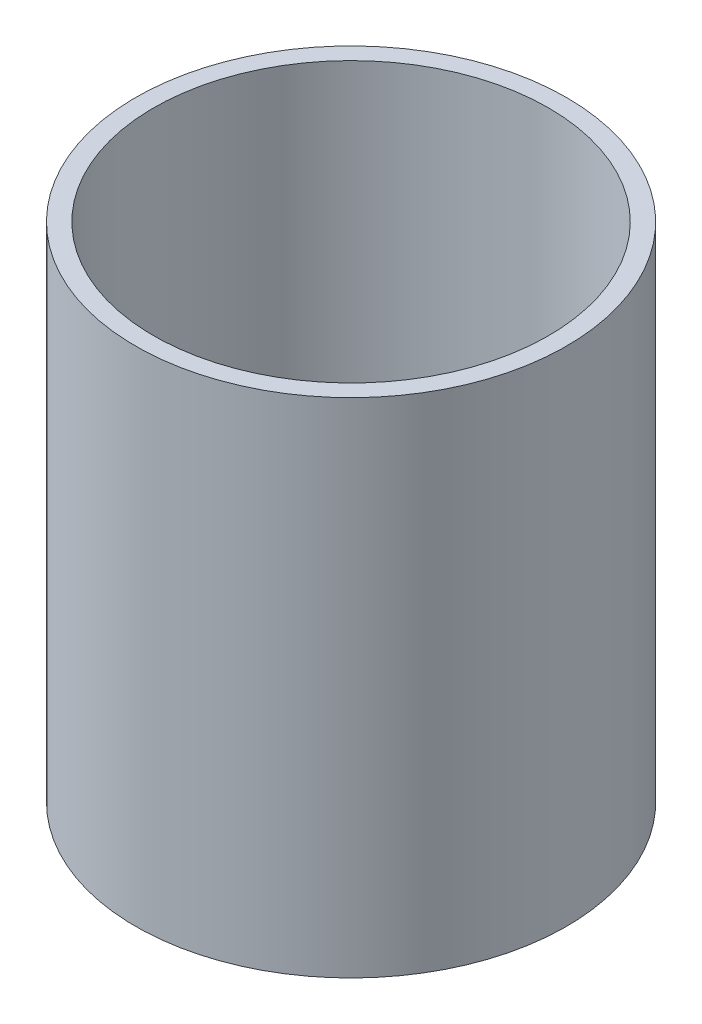
ISO-10303-21;
HEADER;
FILE_DESCRIPTION(('STEP AP214'),'2;1');
FILE_NAME('part.step','',(''),(''),'','','');
FILE_SCHEMA(('AUTOMOTIVE_DESIGN { 1 0 10303 214 1 1 1 1 }'));
ENDSEC;
DATA;
#1=APPLICATION_CONTEXT('core data for automotive mechanical design processes');
#2=APPLICATION_PROTOCOL_DEFINITION('international standard','automotive_design',2000,#1);
#3=PRODUCT_CONTEXT('',#1,'mechanical');
#4=PRODUCT('Part','Part','',(#3));
#5=PRODUCT_RELATED_PRODUCT_CATEGORY('part','',(#4));
#6=PRODUCT_DEFINITION_FORMATION('','',#4);
#7=PRODUCT_DEFINITION_CONTEXT('part definition',#1,'design');
#8=PRODUCT_DEFINITION('design','',#6,#7);
#9=PRODUCT_DEFINITION_SHAPE('','',#8);
#10=(LENGTH_UNIT() NAMED_UNIT(*) SI_UNIT(.MILLI.,.METRE.));
#11=(NAMED_UNIT(*) PLANE_ANGLE_UNIT() SI_UNIT($,.RADIAN.));
#12=(NAMED_UNIT(*) SI_UNIT($,.STERADIAN.) SOLID_ANGLE_UNIT());
#13=UNCERTAINTY_MEASURE_WITH_UNIT(LENGTH_MEASURE(1.E-05),#10,'distance_accuracy_value','');
#14=(GEOMETRIC_REPRESENTATION_CONTEXT(3) GLOBAL_UNCERTAINTY_ASSIGNED_CONTEXT((#13)) GLOBAL_UNIT_ASSIGNED_CONTEXT((#10,
#11,#12)) REPRESENTATION_CONTEXT('',''));
#15=CARTESIAN_POINT('',(0.,0.,0.));
#16=DIRECTION('',(0.,0.,1.));
#17=DIRECTION('',(1.,0.,0.));
#18=AXIS2_PLACEMENT_3D('',#15,#16,#17);
#19=CARTESIAN_POINT('',(0.,42.,0.));
#20=DIRECTION('',(0.,-1.,0.));
#21=DIRECTION('',(0.,0.,-1.));
#22=AXIS2_PLACEMENT_3D('',#19,#20,#21);
#23=CYLINDRICAL_SURFACE('',#22,18.);
#24=CARTESIAN_POINT('',(0.,42.,0.));
#25=DIRECTION('',(0.,1.,0.));
#26=DIRECTION('',(0.,0.,1.));
#27=AXIS2_PLACEMENT_3D('',#24,#25,#26);
#28=CIRCLE('',#27,18.);
#29=CARTESIAN_POINT('',(0.,42.,-18.));
#30=VERTEX_POINT('',#29);
#31=EDGE_CURVE('E10',#30,#30,#28,.T.);
#32=CARTESIAN_POINT('',(0.,0.,0.));
#33=DIRECTION('',(0.,1.,0.));
#34=DIRECTION('',(0.,0.,1.));
#35=AXIS2_PLACEMENT_3D('',#32,#33,#34);
#36=CIRCLE('',#35,18.);
#37=CARTESIAN_POINT('',(0.,0.,-18.));
#38=VERTEX_POINT('',#37);
#39=EDGE_CURVE('E37',#38,#38,#36,.T.);
#40=CARTESIAN_POINT('',(0.,42.,-18.));
#41=CARTESIAN_POINT('',(0.,41.5625,-18.));
#42=CARTESIAN_POINT('',(0.,41.125,-18.));
#43=CARTESIAN_POINT('',(0.,40.25,-18.));
#44=CARTESIAN_POINT('',(0.,39.8125,-18.));
#45=CARTESIAN_POINT('',(0.,38.9375,-18.));
#46=CARTESIAN_POINT('',(0.,38.5,-18.));
#47=CARTESIAN_POINT('',(0.,37.625,-18.));
#48=CARTESIAN_POINT('',(0.,37.1875,-18.));
#49=CARTESIAN_POINT('',(0.,36.3125,-18.));
#50=CARTESIAN_POINT('',(0.,35.875,-18.));
#51=CARTESIAN_POINT('',(0.,35.,-18.));
#52=CARTESIAN_POINT('',(0.,34.5625,-18.));
#53=CARTESIAN_POINT('',(0.,33.6875,-18.));
#54=CARTESIAN_POINT('',(0.,33.25,-18.));
#55=CARTESIAN_POINT('',(0.,32.375,-18.));
#56=CARTESIAN_POINT('',(0.,31.9375,-18.));
#57=CARTESIAN_POINT('',(0.,31.0625,-18.));
#58=CARTESIAN_POINT('',(0.,30.625,-18.));
#59=CARTESIAN_POINT('',(0.,29.75,-18.));
#60=CARTESIAN_POINT('',(0.,29.3125,-18.));
#61=CARTESIAN_POINT('',(0.,28.4375,-18.));
#62=CARTESIAN_POINT('',(0.,28.,-18.));
#63=CARTESIAN_POINT('',(0.,27.125,-18.));
#64=CARTESIAN_POINT('',(0.,26.6875,-18.));
#65=CARTESIAN_POINT('',(0.,25.8125,-18.));
#66=CARTESIAN_POINT('',(0.,25.375,-18.));
#67=CARTESIAN_POINT('',(0.,24.5,-18.));
#68=CARTESIAN_POINT('',(0.,24.0625,-18.));
#69=CARTESIAN_POINT('',(0.,23.1875,-18.));
#70=CARTESIAN_POINT('',(0.,22.75,-18.));
#71=CARTESIAN_POINT('',(0.,21.875,-18.));
#72=CARTESIAN_POINT('',(0.,21.4375,-18.));
#73=CARTESIAN_POINT('',(0.,20.5625,-18.));
#74=CARTESIAN_POINT('',(0.,20.125,-18.));
#75=CARTESIAN_POINT('',(0.,19.25,-18.));
#76=CARTESIAN_POINT('',(0.,18.8125,-18.));
#77=CARTESIAN_POINT('',(0.,17.9375,-18.));
#78=CARTESIAN_POINT('',(0.,17.5,-18.));
#79=CARTESIAN_POINT('',(0.,16.625,-18.));
#80=CARTESIAN_POINT('',(0.,16.1875,-18.));
#81=CARTESIAN_POINT('',(0.,15.3125,-18.));
#82=CARTESIAN_POINT('',(0.,14.875,-18.));
#83=CARTESIAN_POINT('',(0.,14.,-18.));
#84=CARTESIAN_POINT('',(0.,13.5625,-18.));
#85=CARTESIAN_POINT('',(0.,12.6875,-18.));
#86=CARTESIAN_POINT('',(0.,12.25,-18.));
#87=CARTESIAN_POINT('',(0.,11.375,-18.));
#88=CARTESIAN_POINT('',(0.,10.9375,-18.));
#89=CARTESIAN_POINT('',(0.,10.0625,-18.));
#90=CARTESIAN_POINT('',(0.,9.625,-18.));
#91=CARTESIAN_POINT('',(0.,8.75,-18.));
#92=CARTESIAN_POINT('',(0.,8.3125,-18.));
#93=CARTESIAN_POINT('',(0.,7.4375,-18.));
#94=CARTESIAN_POINT('',(0.,7.,-18.));
#95=CARTESIAN_POINT('',(0.,6.125,-18.));
#96=CARTESIAN_POINT('',(0.,5.6875,-18.));
#97=CARTESIAN_POINT('',(0.,4.8125,-18.));
#98=CARTESIAN_POINT('',(0.,4.375,-18.));
#99=CARTESIAN_POINT('',(0.,3.5,-18.));
#100=CARTESIAN_POINT('',(0.,3.0625,-18.));
#101=CARTESIAN_POINT('',(0.,2.1875,-18.));
#102=CARTESIAN_POINT('',(0.,1.75,-18.));
#103=CARTESIAN_POINT('',(0.,0.875000000000001,-18.));
#104=CARTESIAN_POINT('',(0.,0.4375,-18.));
#105=CARTESIAN_POINT('',(0.,0.,-18.));
#106=B_SPLINE_CURVE_WITH_KNOTS('',3,(#40,#41,#42,#43,#44,#45,#46,#47,#48,#49,#50,#51,#52,#53,
#54,#55,#56,#57,#58,#59,#60,#61,#62,#63,#64,#65,#66,#67,#68,#69,#70,#71,#72,#73,#74,#75,#76,#77,
#78,#79,#80,#81,#82,#83,#84,#85,#86,#87,#88,#89,#90,#91,#92,#93,#94,#95,#96,#97,#98,#99,#100,
#101,#102,#103,#104,#105),.UNSPECIFIED.,.F.,.F.,(4,2,2,2,2,2,2,2,2,2,2,2,2,2,2,2,2,2,2,2,2,2,2,
2,2,2,2,2,2,2,2,2,4),(0.,1.31249999999999,2.625,3.9375,5.25,6.5625,7.87499999999999,
9.18749999999999,10.5,11.8125,13.125,14.4375,15.75,17.0625,18.375,19.6875,21.,22.3125,23.625,
24.9375,26.25,27.5625,28.875,30.1875,31.5,32.8125,34.125,35.4375,36.75,38.0625,39.375,40.6875,
42.),.UNSPECIFIED.);
#107=EDGE_CURVE('BSEAM34',#30,#38,#106,.T.);
#108=ORIENTED_EDGE('',*,*,#31,.F.);
#109=ORIENTED_EDGE('',*,*,#39,.T.);
#110=ORIENTED_EDGE('',*,*,#107,.T.);
#111=ORIENTED_EDGE('',*,*,#107,.F.);
#112=EDGE_LOOP('',(#108,#110,#109,#111));
#113=FACE_BOUND('',#112,.T.);
#114=ADVANCED_FACE('F34',(#113),#23,.T.);
#115=CARTESIAN_POINT('',(0.,42.,0.));
#116=DIRECTION('',(0.,1.,0.));
#117=DIRECTION('',(0.,0.,1.));
#118=AXIS2_PLACEMENT_3D('',#115,#116,#117);
#119=PLANE('',#118);
#120=CARTESIAN_POINT('',(0.,42.,0.));
#121=DIRECTION('',(0.,-1.,0.));
#122=DIRECTION('',(0.,0.,-1.));
#123=AXIS2_PLACEMENT_3D('',#120,#121,#122);
#124=CIRCLE('',#123,16.5);
#125=CARTESIAN_POINT('',(0.,42.,-16.5));
#126=VERTEX_POINT('',#125);
#127=EDGE_CURVE('E44',#126,#126,#124,.T.);
#128=ORIENTED_EDGE('',*,*,#127,.T.);
#129=EDGE_LOOP('',(#128));
#130=FACE_BOUND('',#129,.T.);
#131=ORIENTED_EDGE('',*,*,#31,.T.);
#132=EDGE_LOOP('',(#131));
#133=FACE_BOUND('',#132,.T.);
#134=ADVANCED_FACE('F52',(#130,#133),#119,.T.);
#135=CARTESIAN_POINT('',(0.,0.,0.));
#136=DIRECTION('',(0.,1.,0.));
#137=DIRECTION('',(0.,0.,1.));
#138=AXIS2_PLACEMENT_3D('',#135,#136,#137);
#139=PLANE('',#138);
#140=CARTESIAN_POINT('',(0.,0.,0.));
#141=DIRECTION('',(0.,-1.,0.));
#142=DIRECTION('',(0.,0.,-1.));
#143=AXIS2_PLACEMENT_3D('',#140,#141,#142);
#144=CIRCLE('',#143,16.5);
#145=CARTESIAN_POINT('',(0.,0.,-16.5));
#146=VERTEX_POINT('',#145);
#147=EDGE_CURVE('E46',#146,#146,#144,.T.);
#148=ORIENTED_EDGE('',*,*,#147,.F.);
#149=EDGE_LOOP('',(#148));
#150=FACE_BOUND('',#149,.T.);
#151=ORIENTED_EDGE('',*,*,#39,.F.);
#152=EDGE_LOOP('',(#151));
#153=FACE_BOUND('',#152,.T.);
#154=ADVANCED_FACE('F57',(#150,#153),#139,.F.);
#155=CARTESIAN_POINT('',(0.,42.,0.));
#156=DIRECTION('',(0.,-1.,0.));
#157=DIRECTION('',(0.,0.,-1.));
#158=AXIS2_PLACEMENT_3D('',#155,#156,#157);
#159=CYLINDRICAL_SURFACE('',#158,16.5);
#160=CARTESIAN_POINT('',(0.,42.,-16.5));
#161=CARTESIAN_POINT('',(0.,41.5625,-16.5));
#162=CARTESIAN_POINT('',(0.,41.125,-16.5));
#163=CARTESIAN_POINT('',(0.,40.25,-16.5));
#164=CARTESIAN_POINT('',(0.,39.8125,-16.5));
#165=CARTESIAN_POINT('',(0.,38.9375,-16.5));
#166=CARTESIAN_POINT('',(0.,38.5,-16.5));
#167=CARTESIAN_POINT('',(0.,37.625,-16.5));
#168=CARTESIAN_POINT('',(0.,37.1875,-16.5));
#169=CARTESIAN_POINT('',(0.,36.3125,-16.5));
#170=CARTESIAN_POINT('',(0.,35.875,-16.5));
#171=CARTESIAN_POINT('',(0.,35.,-16.5));
#172=CARTESIAN_POINT('',(0.,34.5625,-16.5));
#173=CARTESIAN_POINT('',(0.,33.6875,-16.5));
#174=CARTESIAN_POINT('',(0.,33.25,-16.5));
#175=CARTESIAN_POINT('',(0.,32.375,-16.5));
#176=CARTESIAN_POINT('',(0.,31.9375,-16.5));
#177=CARTESIAN_POINT('',(0.,31.0625,-16.5));
#178=CARTESIAN_POINT('',(0.,30.625,-16.5));
#179=CARTESIAN_POINT('',(0.,29.75,-16.5));
#180=CARTESIAN_POINT('',(0.,29.3125,-16.5));
#181=CARTESIAN_POINT('',(0.,28.4375,-16.5));
#182=CARTESIAN_POINT('',(0.,28.,-16.5));
#183=CARTESIAN_POINT('',(0.,27.125,-16.5));
#184=CARTESIAN_POINT('',(0.,26.6875,-16.5));
#185=CARTESIAN_POINT('',(0.,25.8125,-16.5));
#186=CARTESIAN_POINT('',(0.,25.375,-16.5));
#187=CARTESIAN_POINT('',(0.,24.5,-16.5));
#188=CARTESIAN_POINT('',(0.,24.0625,-16.5));
#189=CARTESIAN_POINT('',(0.,23.1875,-16.5));
#190=CARTESIAN_POINT('',(0.,22.75,-16.5));
#191=CARTESIAN_POINT('',(0.,21.875,-16.5));
#192=CARTESIAN_POINT('',(0.,21.4375,-16.5));
#193=CARTESIAN_POINT('',(0.,20.5625,-16.5));
#194=CARTESIAN_POINT('',(0.,20.125,-16.5));
#195=CARTESIAN_POINT('',(0.,19.25,-16.5));
#196=CARTESIAN_POINT('',(0.,18.8125,-16.5));
#197=CARTESIAN_POINT('',(0.,17.9375,-16.5));
#198=CARTESIAN_POINT('',(0.,17.5,-16.5));
#199=CARTESIAN_POINT('',(0.,16.625,-16.5));
#200=CARTESIAN_POINT('',(0.,16.1875,-16.5));
#201=CARTESIAN_POINT('',(0.,15.3125,-16.5));
#202=CARTESIAN_POINT('',(0.,14.875,-16.5));
#203=CARTESIAN_POINT('',(0.,14.,-16.5));
#204=CARTESIAN_POINT('',(0.,13.5625,-16.5));
#205=CARTESIAN_POINT('',(0.,12.6875,-16.5));
#206=CARTESIAN_POINT('',(0.,12.25,-16.5));
#207=CARTESIAN_POINT('',(0.,11.375,-16.5));
#208=CARTESIAN_POINT('',(0.,10.9375,-16.5));
#209=CARTESIAN_POINT('',(0.,10.0625,-16.5));
#210=CARTESIAN_POINT('',(0.,9.625,-16.5));
#211=CARTESIAN_POINT('',(0.,8.75,-16.5));
#212=CARTESIAN_POINT('',(0.,8.3125,-16.5));
#213=CARTESIAN_POINT('',(0.,7.4375,-16.5));
#214=CARTESIAN_POINT('',(0.,7.,-16.5));
#215=CARTESIAN_POINT('',(0.,6.12500000000001,-16.5));
#216=CARTESIAN_POINT('',(0.,5.68750000000001,-16.5));
#217=CARTESIAN_POINT('',(0.,4.8125,-16.5));
#218=CARTESIAN_POINT('',(0.,4.375,-16.5));
#219=CARTESIAN_POINT('',(0.,3.5,-16.5));
#220=CARTESIAN_POINT('',(0.,3.0625,-16.5));
#221=CARTESIAN_POINT('',(0.,2.1875,-16.5));
#222=CARTESIAN_POINT('',(0.,1.75,-16.5));
#223=CARTESIAN_POINT('',(0.,0.875000000000001,-16.5));
#224=CARTESIAN_POINT('',(0.,0.4375,-16.5));
#225=CARTESIAN_POINT('',(0.,0.,-16.5));
#226=B_SPLINE_CURVE_WITH_KNOTS('',3,(#160,#161,#162,#163,#164,#165,#166,#167,#168,#169,#170,
#171,#172,#173,#174,#175,#176,#177,#178,#179,#180,#181,#182,#183,#184,#185,#186,#187,#188,#189,
#190,#191,#192,#193,#194,#195,#196,#197,#198,#199,#200,#201,#202,#203,#204,#205,#206,#207,#208,
#209,#210,#211,#212,#213,#214,#215,#216,#217,#218,#219,#220,#221,#222,#223,#224,#225),
.UNSPECIFIED.,.F.,.F.,(4,2,2,2,2,2,2,2,2,2,2,2,2,2,2,2,2,2,2,2,2,2,2,2,2,2,2,2,2,2,2,2,4),(0.,
1.3125,2.625,3.9375,5.25,6.56250000000001,7.87500000000001,9.1875,10.5,11.8125,13.125,14.4375,
15.75,17.0625,18.375,19.6875,21.,22.3125,23.625,24.9375,26.25,27.5625,28.875,30.1875,31.5,
32.8125,34.125,35.4375,36.75,38.0625,39.375,40.6875,42.),.UNSPECIFIED.);
#227=EDGE_CURVE('BSEAM54',#126,#146,#226,.T.);
#228=ORIENTED_EDGE('',*,*,#127,.F.);
#229=ORIENTED_EDGE('',*,*,#147,.T.);
#230=ORIENTED_EDGE('',*,*,#227,.T.);
#231=ORIENTED_EDGE('',*,*,#227,.F.);
#232=EDGE_LOOP('',(#228,#230,#229,#231));
#233=FACE_BOUND('',#232,.T.);
#234=ADVANCED_FACE('F54',(#233),#159,.F.);
#235=CLOSED_SHELL('',(#114,#134,#154,#234));
#236=MANIFOLD_SOLID_BREP('B2',#235);
#237=ADVANCED_BREP_SHAPE_REPRESENTATION('',(#18,#236),#14);
#238=SHAPE_DEFINITION_REPRESENTATION(#9,#237);
ENDSEC;
END-ISO-10303-21;
